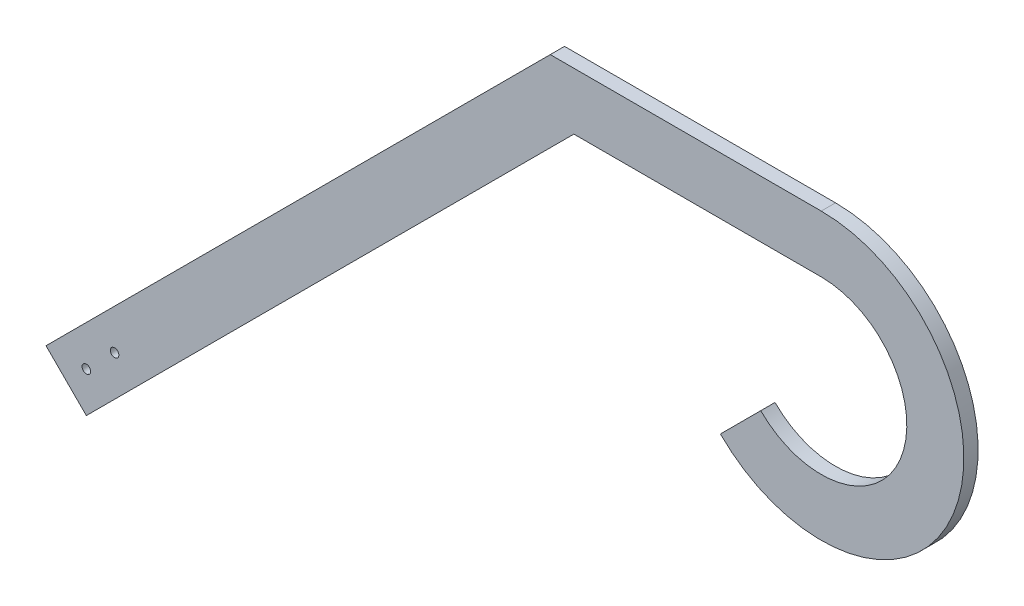
ISO-10303-21;
HEADER;
FILE_DESCRIPTION(('STEP AP214'),'2;1');
FILE_NAME('part.step','',(''),(''),'','','');
FILE_SCHEMA(('AUTOMOTIVE_DESIGN { 1 0 10303 214 1 1 1 1 }'));
ENDSEC;
DATA;
#1=APPLICATION_CONTEXT('core data for automotive mechanical design processes');
#2=APPLICATION_PROTOCOL_DEFINITION('international standard','automotive_design',2000,#1);
#3=PRODUCT_CONTEXT('',#1,'mechanical');
#4=PRODUCT('Part','Part','',(#3));
#5=PRODUCT_RELATED_PRODUCT_CATEGORY('part','',(#4));
#6=PRODUCT_DEFINITION_FORMATION('','',#4);
#7=PRODUCT_DEFINITION_CONTEXT('part definition',#1,'design');
#8=PRODUCT_DEFINITION('design','',#6,#7);
#9=PRODUCT_DEFINITION_SHAPE('','',#8);
#10=(LENGTH_UNIT() NAMED_UNIT(*) SI_UNIT(.MILLI.,.METRE.));
#11=(NAMED_UNIT(*) PLANE_ANGLE_UNIT() SI_UNIT($,.RADIAN.));
#12=(NAMED_UNIT(*) SI_UNIT($,.STERADIAN.) SOLID_ANGLE_UNIT());
#13=UNCERTAINTY_MEASURE_WITH_UNIT(LENGTH_MEASURE(1.E-05),#10,'distance_accuracy_value','');
#14=(GEOMETRIC_REPRESENTATION_CONTEXT(3) GLOBAL_UNCERTAINTY_ASSIGNED_CONTEXT((#13)) GLOBAL_UNIT_ASSIGNED_CONTEXT((#10,
#11,#12)) REPRESENTATION_CONTEXT('',''));
#15=CARTESIAN_POINT('',(0.,0.,0.));
#16=DIRECTION('',(0.,0.,1.));
#17=DIRECTION('',(1.,0.,0.));
#18=AXIS2_PLACEMENT_3D('',#15,#16,#17);
#19=CARTESIAN_POINT('',(0.,0.,5.));
#20=DIRECTION('',(0.,0.,-1.));
#21=DIRECTION('',(-1.,0.,0.));
#22=AXIS2_PLACEMENT_3D('',#19,#20,#21);
#23=CYLINDRICAL_SURFACE('',#22,50.);
#24=CARTESIAN_POINT('',(0.,0.,0.));
#25=DIRECTION('',(0.,0.,1.));
#26=DIRECTION('',(1.,0.,0.));
#27=AXIS2_PLACEMENT_3D('',#24,#25,#26);
#28=CIRCLE('',#27,50.);
#29=CARTESIAN_POINT('',(-35.3553390593273,-35.3553390593275,0.));
#30=VERTEX_POINT('',#29);
#31=CARTESIAN_POINT('',(0.,50.,0.));
#32=VERTEX_POINT('',#31);
#33=EDGE_CURVE('E129',#30,#32,#28,.T.);
#34=ORIENTED_EDGE('',*,*,#33,.T.);
#35=DIRECTION('',(0.,0.,-1.));
#36=VECTOR('',#35,1.);
#37=CARTESIAN_POINT('',(0.,50.,5.));
#38=LINE('',#37,#36);
#39=CARTESIAN_POINT('',(0.,50.,5.));
#40=VERTEX_POINT('',#39);
#41=EDGE_CURVE('E11',#40,#32,#38,.T.);
#42=ORIENTED_EDGE('',*,*,#41,.F.);
#43=CARTESIAN_POINT('',(0.,0.,5.));
#44=DIRECTION('',(0.,0.,1.));
#45=DIRECTION('',(1.,0.,0.));
#46=AXIS2_PLACEMENT_3D('',#43,#44,#45);
#47=CIRCLE('',#46,50.);
#48=CARTESIAN_POINT('',(-35.3553390593273,-35.3553390593275,5.));
#49=VERTEX_POINT('',#48);
#50=EDGE_CURVE('E144',#49,#40,#47,.T.);
#51=ORIENTED_EDGE('',*,*,#50,.F.);
#52=DIRECTION('',(0.,0.,-1.));
#53=VECTOR('',#52,1.);
#54=CARTESIAN_POINT('',(-35.3553390593273,-35.3553390593275,5.));
#55=LINE('',#54,#53);
#56=EDGE_CURVE('E125',#49,#30,#55,.T.);
#57=ORIENTED_EDGE('',*,*,#56,.T.);
#58=EDGE_LOOP('',(#34,#42,#51,#57));
#59=FACE_BOUND('',#58,.T.);
#60=ADVANCED_FACE('F33',(#59),#23,.T.);
#61=CARTESIAN_POINT('',(0.,50.,5.));
#62=DIRECTION('',(0.,-1.,0.));
#63=DIRECTION('',(1.,0.,0.));
#64=AXIS2_PLACEMENT_3D('',#61,#62,#63);
#65=PLANE('',#64);
#66=DIRECTION('',(-1.,0.,0.));
#67=VECTOR('',#66,1.);
#68=CARTESIAN_POINT('',(0.,50.,0.));
#69=LINE('',#68,#67);
#70=CARTESIAN_POINT('',(-95.,50.,0.));
#71=VERTEX_POINT('',#70);
#72=EDGE_CURVE('E132',#32,#71,#69,.T.);
#73=ORIENTED_EDGE('',*,*,#72,.T.);
#74=DIRECTION('',(0.,0.,-1.));
#75=VECTOR('',#74,1.);
#76=CARTESIAN_POINT('',(-95.,50.,5.));
#77=LINE('',#76,#75);
#78=CARTESIAN_POINT('',(-95.,50.,5.));
#79=VERTEX_POINT('',#78);
#80=EDGE_CURVE('E41',#79,#71,#77,.T.);
#81=ORIENTED_EDGE('',*,*,#80,.F.);
#82=DIRECTION('',(-1.,0.,0.));
#83=VECTOR('',#82,1.);
#84=CARTESIAN_POINT('',(0.,50.,5.));
#85=LINE('',#84,#83);
#86=EDGE_CURVE('E92',#40,#79,#85,.T.);
#87=ORIENTED_EDGE('',*,*,#86,.F.);
#88=ORIENTED_EDGE('',*,*,#41,.T.);
#89=EDGE_LOOP('',(#73,#81,#87,#88));
#90=FACE_BOUND('',#89,.T.);
#91=ADVANCED_FACE('F214',(#90),#65,.F.);
#92=CARTESIAN_POINT('',(-95.,50.,5.));
#93=DIRECTION('',(0.707106781186549,-0.707106781186546,0.));
#94=DIRECTION('',(0.707106781186546,0.707106781186549,0.));
#95=AXIS2_PLACEMENT_3D('',#92,#93,#94);
#96=PLANE('',#95);
#97=DIRECTION('',(-0.707106781186546,-0.707106781186549,0.));
#98=VECTOR('',#97,1.);
#99=CARTESIAN_POINT('',(-95.,50.,0.));
#100=LINE('',#99,#98);
#101=CARTESIAN_POINT('',(-271.776695296636,-126.776695296637,0.));
#102=VERTEX_POINT('',#101);
#103=EDGE_CURVE('E135',#71,#102,#100,.T.);
#104=ORIENTED_EDGE('',*,*,#103,.T.);
#105=DIRECTION('',(0.,0.,-1.));
#106=VECTOR('',#105,1.);
#107=CARTESIAN_POINT('',(-271.776695296636,-126.776695296637,5.));
#108=LINE('',#107,#106);
#109=CARTESIAN_POINT('',(-271.776695296636,-126.776695296637,5.));
#110=VERTEX_POINT('',#109);
#111=EDGE_CURVE('E151',#110,#102,#108,.T.);
#112=ORIENTED_EDGE('',*,*,#111,.F.);
#113=DIRECTION('',(-0.707106781186546,-0.707106781186549,0.));
#114=VECTOR('',#113,1.);
#115=CARTESIAN_POINT('',(-95.,50.,5.));
#116=LINE('',#115,#114);
#117=EDGE_CURVE('E159',#79,#110,#116,.T.);
#118=ORIENTED_EDGE('',*,*,#117,.F.);
#119=ORIENTED_EDGE('',*,*,#80,.T.);
#120=EDGE_LOOP('',(#104,#112,#118,#119));
#121=FACE_BOUND('',#120,.T.);
#122=ADVANCED_FACE('F157',(#121),#96,.F.);
#123=CARTESIAN_POINT('',(-271.776695296636,-126.776695296637,5.));
#124=DIRECTION('',(0.707106781186548,0.707106781186547,0.));
#125=DIRECTION('',(-0.707106781186547,0.707106781186548,0.));
#126=AXIS2_PLACEMENT_3D('',#123,#124,#125);
#127=PLANE('',#126);
#128=DIRECTION('',(0.707106781186547,-0.707106781186548,0.));
#129=VECTOR('',#128,1.);
#130=CARTESIAN_POINT('',(-271.776695296636,-126.776695296637,0.));
#131=LINE('',#130,#129);
#132=CARTESIAN_POINT('',(-257.634559672906,-140.918830920368,0.));
#133=VERTEX_POINT('',#132);
#134=EDGE_CURVE('E137',#102,#133,#131,.T.);
#135=ORIENTED_EDGE('',*,*,#134,.T.);
#136=DIRECTION('',(0.,0.,-1.));
#137=VECTOR('',#136,1.);
#138=CARTESIAN_POINT('',(-257.634559672906,-140.918830920368,5.));
#139=LINE('',#138,#137);
#140=CARTESIAN_POINT('',(-257.634559672906,-140.918830920368,5.));
#141=VERTEX_POINT('',#140);
#142=EDGE_CURVE('E148',#141,#133,#139,.T.);
#143=ORIENTED_EDGE('',*,*,#142,.F.);
#144=DIRECTION('',(0.707106781186547,-0.707106781186548,0.));
#145=VECTOR('',#144,1.);
#146=CARTESIAN_POINT('',(-271.776695296636,-126.776695296637,5.));
#147=LINE('',#146,#145);
#148=EDGE_CURVE('E171',#110,#141,#147,.T.);
#149=ORIENTED_EDGE('',*,*,#148,.F.);
#150=ORIENTED_EDGE('',*,*,#111,.T.);
#151=EDGE_LOOP('',(#135,#143,#149,#150));
#152=FACE_BOUND('',#151,.T.);
#153=ADVANCED_FACE('F167',(#152),#127,.F.);
#154=CARTESIAN_POINT('',(-86.7157287525381,30.,5.));
#155=DIRECTION('',(-0.707106781186548,0.707106781186548,0.));
#156=DIRECTION('',(-0.707106781186548,-0.707106781186548,0.));
#157=AXIS2_PLACEMENT_3D('',#154,#155,#156);
#158=PLANE('',#157);
#159=DIRECTION('',(0.707106781186547,0.707106781186547,0.));
#160=VECTOR('',#159,1.);
#161=CARTESIAN_POINT('',(-86.7157287525381,30.,0.));
#162=LINE('',#161,#160);
#163=CARTESIAN_POINT('',(-86.7157287525381,30.,0.));
#164=VERTEX_POINT('',#163);
#165=EDGE_CURVE('E139',#133,#164,#162,.T.);
#166=ORIENTED_EDGE('',*,*,#165,.T.);
#167=DIRECTION('',(0.,0.,-1.));
#168=VECTOR('',#167,1.);
#169=CARTESIAN_POINT('',(-86.7157287525381,30.,5.));
#170=LINE('',#169,#168);
#171=CARTESIAN_POINT('',(-86.7157287525381,30.,5.));
#172=VERTEX_POINT('',#171);
#173=EDGE_CURVE('E120',#172,#164,#170,.T.);
#174=ORIENTED_EDGE('',*,*,#173,.F.);
#175=DIRECTION('',(0.707106781186547,0.707106781186547,0.));
#176=VECTOR('',#175,1.);
#177=CARTESIAN_POINT('',(-86.7157287525381,30.,5.));
#178=LINE('',#177,#176);
#179=EDGE_CURVE('E111',#141,#172,#178,.T.);
#180=ORIENTED_EDGE('',*,*,#179,.F.);
#181=ORIENTED_EDGE('',*,*,#142,.T.);
#182=EDGE_LOOP('',(#166,#174,#180,#181));
#183=FACE_BOUND('',#182,.T.);
#184=ADVANCED_FACE('F170',(#183),#158,.F.);
#185=CARTESIAN_POINT('',(0.,30.,5.));
#186=DIRECTION('',(0.,1.,0.));
#187=DIRECTION('',(0.,0.,1.));
#188=AXIS2_PLACEMENT_3D('',#185,#186,#187);
#189=PLANE('',#188);
#190=DIRECTION('',(1.,0.,0.));
#191=VECTOR('',#190,1.);
#192=CARTESIAN_POINT('',(0.,30.,0.));
#193=LINE('',#192,#191);
#194=CARTESIAN_POINT('',(0.,30.,0.));
#195=VERTEX_POINT('',#194);
#196=EDGE_CURVE('E119',#164,#195,#193,.T.);
#197=ORIENTED_EDGE('',*,*,#196,.T.);
#198=DIRECTION('',(0.,0.,-1.));
#199=VECTOR('',#198,1.);
#200=CARTESIAN_POINT('',(0.,30.,5.));
#201=LINE('',#200,#199);
#202=CARTESIAN_POINT('',(0.,30.,5.));
#203=VERTEX_POINT('',#202);
#204=EDGE_CURVE('E116',#203,#195,#201,.T.);
#205=ORIENTED_EDGE('',*,*,#204,.F.);
#206=DIRECTION('',(1.,0.,0.));
#207=VECTOR('',#206,1.);
#208=CARTESIAN_POINT('',(0.,30.,5.));
#209=LINE('',#208,#207);
#210=EDGE_CURVE('E105',#172,#203,#209,.T.);
#211=ORIENTED_EDGE('',*,*,#210,.F.);
#212=ORIENTED_EDGE('',*,*,#173,.T.);
#213=EDGE_LOOP('',(#197,#205,#211,#212));
#214=FACE_BOUND('',#213,.T.);
#215=ADVANCED_FACE('F117',(#214),#189,.F.);
#216=CARTESIAN_POINT('',(0.,0.,5.));
#217=DIRECTION('',(0.,0.,-1.));
#218=DIRECTION('',(-1.,0.,0.));
#219=AXIS2_PLACEMENT_3D('',#216,#217,#218);
#220=CYLINDRICAL_SURFACE('',#219,30.);
#221=CARTESIAN_POINT('',(0.,0.,0.));
#222=DIRECTION('',(0.,0.,-1.));
#223=DIRECTION('',(1.,0.,0.));
#224=AXIS2_PLACEMENT_3D('',#221,#222,#223);
#225=CIRCLE('',#224,30.);
#226=CARTESIAN_POINT('',(-21.2132034355964,-21.2132034355965,0.));
#227=VERTEX_POINT('',#226);
#228=EDGE_CURVE('E78',#195,#227,#225,.T.);
#229=ORIENTED_EDGE('',*,*,#228,.T.);
#230=DIRECTION('',(0.,0.,-1.));
#231=VECTOR('',#230,1.);
#232=CARTESIAN_POINT('',(-21.2132034355964,-21.2132034355965,5.));
#233=LINE('',#232,#231);
#234=CARTESIAN_POINT('',(-21.2132034355964,-21.2132034355965,5.));
#235=VERTEX_POINT('',#234);
#236=EDGE_CURVE('E121',#235,#227,#233,.T.);
#237=ORIENTED_EDGE('',*,*,#236,.F.);
#238=CARTESIAN_POINT('',(0.,0.,5.));
#239=DIRECTION('',(0.,0.,-1.));
#240=DIRECTION('',(1.,0.,0.));
#241=AXIS2_PLACEMENT_3D('',#238,#239,#240);
#242=CIRCLE('',#241,30.);
#243=EDGE_CURVE('E109',#203,#235,#242,.T.);
#244=ORIENTED_EDGE('',*,*,#243,.F.);
#245=ORIENTED_EDGE('',*,*,#204,.T.);
#246=EDGE_LOOP('',(#229,#237,#244,#245));
#247=FACE_BOUND('',#246,.T.);
#248=ADVANCED_FACE('F123',(#247),#220,.F.);
#249=CARTESIAN_POINT('',(-21.2132034355964,-21.2132034355965,5.));
#250=DIRECTION('',(0.707106781186549,-0.707106781186546,0.));
#251=DIRECTION('',(0.707106781186546,0.707106781186549,0.));
#252=AXIS2_PLACEMENT_3D('',#249,#250,#251);
#253=PLANE('',#252);
#254=DIRECTION('',(-0.707106781186546,-0.707106781186549,0.));
#255=VECTOR('',#254,1.);
#256=CARTESIAN_POINT('',(-21.2132034355964,-21.2132034355965,0.));
#257=LINE('',#256,#255);
#258=EDGE_CURVE('E84',#227,#30,#257,.T.);
#259=ORIENTED_EDGE('',*,*,#258,.T.);
#260=ORIENTED_EDGE('',*,*,#56,.F.);
#261=DIRECTION('',(-0.707106781186546,-0.707106781186549,0.));
#262=VECTOR('',#261,1.);
#263=CARTESIAN_POINT('',(-21.2132034355964,-21.2132034355965,5.));
#264=LINE('',#263,#262);
#265=EDGE_CURVE('E49',#235,#49,#264,.T.);
#266=ORIENTED_EDGE('',*,*,#265,.F.);
#267=ORIENTED_EDGE('',*,*,#236,.T.);
#268=EDGE_LOOP('',(#259,#260,#266,#267));
#269=FACE_BOUND('',#268,.T.);
#270=ADVANCED_FACE('F200',(#269),#253,.F.);
#271=CARTESIAN_POINT('',(0.,0.,5.));
#272=DIRECTION('',(0.,0.,1.));
#273=DIRECTION('',(1.,0.,0.));
#274=AXIS2_PLACEMENT_3D('',#271,#272,#273);
#275=PLANE('',#274);
#276=CARTESIAN_POINT('',(-257.634559672906,-126.776695296637,5.));
#277=DIRECTION('',(0.,0.,1.));
#278=DIRECTION('',(1.,0.,0.));
#279=AXIS2_PLACEMENT_3D('',#276,#277,#278);
#280=CIRCLE('',#279,1.50000000000002);
#281=CARTESIAN_POINT('',(-256.134559672906,-126.776695296637,5.));
#282=VERTEX_POINT('',#281);
#283=EDGE_CURVE('E183',#282,#282,#280,.T.);
#284=ORIENTED_EDGE('',*,*,#283,.F.);
#285=EDGE_LOOP('',(#284));
#286=FACE_BOUND('',#285,.T.);
#287=CARTESIAN_POINT('',(-247.735064736294,-116.877200360025,5.));
#288=DIRECTION('',(0.,0.,1.));
#289=DIRECTION('',(1.,0.,0.));
#290=AXIS2_PLACEMENT_3D('',#287,#288,#289);
#291=CIRCLE('',#290,1.5);
#292=CARTESIAN_POINT('',(-246.235064736294,-116.877200360025,5.));
#293=VERTEX_POINT('',#292);
#294=EDGE_CURVE('E177',#293,#293,#291,.T.);
#295=ORIENTED_EDGE('',*,*,#294,.F.);
#296=EDGE_LOOP('',(#295));
#297=FACE_BOUND('',#296,.T.);
#298=ORIENTED_EDGE('',*,*,#50,.T.);
#299=ORIENTED_EDGE('',*,*,#86,.T.);
#300=ORIENTED_EDGE('',*,*,#117,.T.);
#301=ORIENTED_EDGE('',*,*,#148,.T.);
#302=ORIENTED_EDGE('',*,*,#179,.T.);
#303=ORIENTED_EDGE('',*,*,#210,.T.);
#304=ORIENTED_EDGE('',*,*,#243,.T.);
#305=ORIENTED_EDGE('',*,*,#265,.T.);
#306=EDGE_LOOP('',(#298,#299,#300,#301,#302,#303,#304,#305));
#307=FACE_BOUND('',#306,.T.);
#308=ADVANCED_FACE('F107',(#286,#297,#307),#275,.T.);
#309=CARTESIAN_POINT('',(0.,0.,0.));
#310=DIRECTION('',(0.,0.,1.));
#311=DIRECTION('',(1.,0.,0.));
#312=AXIS2_PLACEMENT_3D('',#309,#310,#311);
#313=PLANE('',#312);
#314=CARTESIAN_POINT('',(-257.634559672906,-126.776695296637,0.));
#315=DIRECTION('',(0.,0.,1.));
#316=DIRECTION('',(1.,0.,0.));
#317=AXIS2_PLACEMENT_3D('',#314,#315,#316);
#318=CIRCLE('',#317,1.50000000000002);
#319=CARTESIAN_POINT('',(-256.134559672906,-126.776695296637,0.));
#320=VERTEX_POINT('',#319);
#321=EDGE_CURVE('E133',#320,#320,#318,.T.);
#322=ORIENTED_EDGE('',*,*,#321,.T.);
#323=EDGE_LOOP('',(#322));
#324=FACE_BOUND('',#323,.T.);
#325=CARTESIAN_POINT('',(-247.735064736294,-116.877200360025,0.));
#326=DIRECTION('',(0.,0.,1.));
#327=DIRECTION('',(1.,0.,0.));
#328=AXIS2_PLACEMENT_3D('',#325,#326,#327);
#329=CIRCLE('',#328,1.5);
#330=CARTESIAN_POINT('',(-246.235064736294,-116.877200360025,0.));
#331=VERTEX_POINT('',#330);
#332=EDGE_CURVE('E180',#331,#331,#329,.T.);
#333=ORIENTED_EDGE('',*,*,#332,.T.);
#334=EDGE_LOOP('',(#333));
#335=FACE_BOUND('',#334,.T.);
#336=ORIENTED_EDGE('',*,*,#33,.F.);
#337=ORIENTED_EDGE('',*,*,#258,.F.);
#338=ORIENTED_EDGE('',*,*,#228,.F.);
#339=ORIENTED_EDGE('',*,*,#196,.F.);
#340=ORIENTED_EDGE('',*,*,#165,.F.);
#341=ORIENTED_EDGE('',*,*,#134,.F.);
#342=ORIENTED_EDGE('',*,*,#103,.F.);
#343=ORIENTED_EDGE('',*,*,#72,.F.);
#344=EDGE_LOOP('',(#336,#337,#338,#339,#340,#341,#342,#343));
#345=FACE_BOUND('',#344,.T.);
#346=ADVANCED_FACE('F163',(#324,#335,#345),#313,.F.);
#347=CARTESIAN_POINT('',(-247.735064736294,-116.877200360025,0.));
#348=DIRECTION('',(0.,0.,1.));
#349=DIRECTION('',(1.,0.,0.));
#350=AXIS2_PLACEMENT_3D('',#347,#348,#349);
#351=CYLINDRICAL_SURFACE('',#350,1.5);
#352=ORIENTED_EDGE('',*,*,#332,.F.);
#353=EDGE_LOOP('',(#352));
#354=FACE_BOUND('',#353,.T.);
#355=ORIENTED_EDGE('',*,*,#294,.T.);
#356=EDGE_LOOP('',(#355));
#357=FACE_BOUND('',#356,.T.);
#358=ADVANCED_FACE('F194',(#354,#357),#351,.F.);
#359=CARTESIAN_POINT('',(-257.634559672906,-126.776695296637,0.));
#360=DIRECTION('',(0.,0.,1.));
#361=DIRECTION('',(1.,0.,0.));
#362=AXIS2_PLACEMENT_3D('',#359,#360,#361);
#363=CYLINDRICAL_SURFACE('',#362,1.50000000000002);
#364=ORIENTED_EDGE('',*,*,#321,.F.);
#365=EDGE_LOOP('',(#364));
#366=FACE_BOUND('',#365,.T.);
#367=ORIENTED_EDGE('',*,*,#283,.T.);
#368=EDGE_LOOP('',(#367));
#369=FACE_BOUND('',#368,.T.);
#370=ADVANCED_FACE('F191',(#366,#369),#363,.F.);
#371=CLOSED_SHELL('',(#60,#91,#122,#153,#184,#215,#248,#270,#308,#346,#358,#370));
#372=MANIFOLD_SOLID_BREP('B2',#371);
#373=ADVANCED_BREP_SHAPE_REPRESENTATION('',(#18,#372),#14);
#374=SHAPE_DEFINITION_REPRESENTATION(#9,#373);
ENDSEC;
END-ISO-10303-21;
